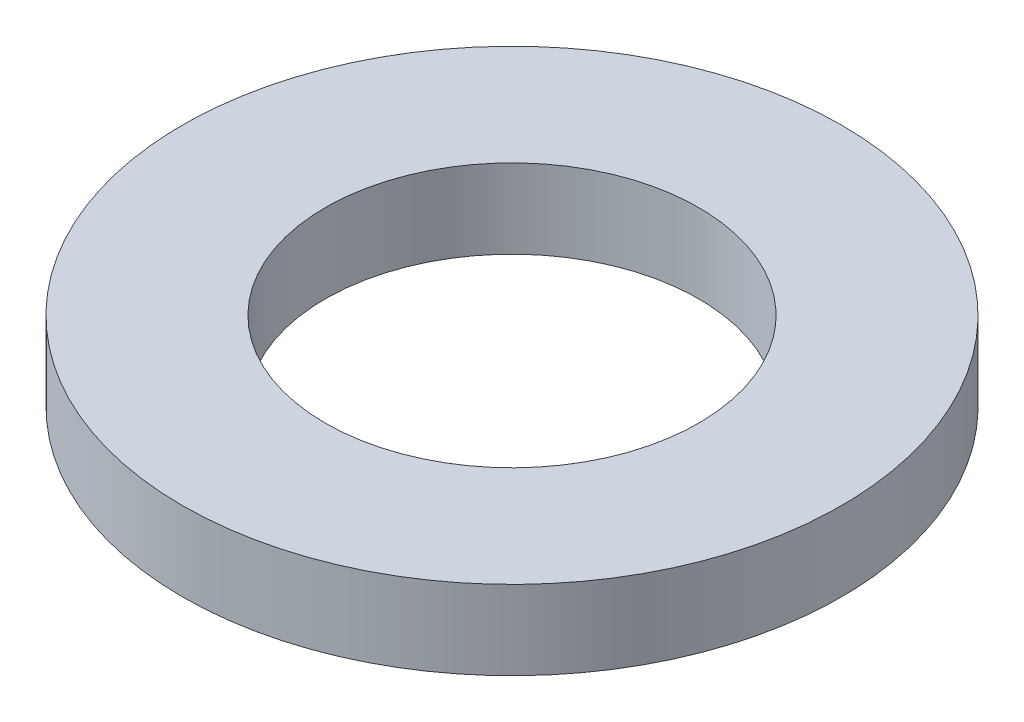
ISO-10303-21;
HEADER;
FILE_DESCRIPTION(('STEP AP214'),'2;1');
FILE_NAME('part.step','',(''),(''),'','','');
FILE_SCHEMA(('AUTOMOTIVE_DESIGN { 1 0 10303 214 1 1 1 1 }'));
ENDSEC;
DATA;
#1=APPLICATION_CONTEXT('core data for automotive mechanical design processes');
#2=APPLICATION_PROTOCOL_DEFINITION('international standard','automotive_design',2000,#1);
#3=PRODUCT_CONTEXT('',#1,'mechanical');
#4=PRODUCT('Part','Part','',(#3));
#5=PRODUCT_RELATED_PRODUCT_CATEGORY('part','',(#4));
#6=PRODUCT_DEFINITION_FORMATION('','',#4);
#7=PRODUCT_DEFINITION_CONTEXT('part definition',#1,'design');
#8=PRODUCT_DEFINITION('design','',#6,#7);
#9=PRODUCT_DEFINITION_SHAPE('','',#8);
#10=(LENGTH_UNIT() NAMED_UNIT(*) SI_UNIT(.MILLI.,.METRE.));
#11=(NAMED_UNIT(*) PLANE_ANGLE_UNIT() SI_UNIT($,.RADIAN.));
#12=(NAMED_UNIT(*) SI_UNIT($,.STERADIAN.) SOLID_ANGLE_UNIT());
#13=UNCERTAINTY_MEASURE_WITH_UNIT(LENGTH_MEASURE(1.E-05),#10,'distance_accuracy_value','');
#14=(GEOMETRIC_REPRESENTATION_CONTEXT(3) GLOBAL_UNCERTAINTY_ASSIGNED_CONTEXT((#13)) GLOBAL_UNIT_ASSIGNED_CONTEXT((#10,
#11,#12)) REPRESENTATION_CONTEXT('',''));
#15=CARTESIAN_POINT('',(0.,0.,0.));
#16=DIRECTION('',(0.,0.,1.));
#17=DIRECTION('',(1.,0.,0.));
#18=AXIS2_PLACEMENT_3D('',#15,#16,#17);
#19=CARTESIAN_POINT('',(0.,1.8,0.));
#20=DIRECTION('',(0.,1.,0.));
#21=DIRECTION('',(0.,0.,1.));
#22=AXIS2_PLACEMENT_3D('',#19,#20,#21);
#23=PLANE('',#22);
#24=CARTESIAN_POINT('',(0.,1.8,0.));
#25=DIRECTION('',(0.,1.,0.));
#26=DIRECTION('',(0.,0.,1.));
#27=AXIS2_PLACEMENT_3D('',#24,#25,#26);
#28=CIRCLE('',#27,7.5);
#29=CARTESIAN_POINT('',(0.,1.8,7.5));
#30=VERTEX_POINT('',#29);
#31=EDGE_CURVE('E10',#30,#30,#28,.T.);
#32=ORIENTED_EDGE('',*,*,#31,.T.);
#33=EDGE_LOOP('',(#32));
#34=FACE_BOUND('',#33,.T.);
#35=CARTESIAN_POINT('',(0.,1.8,0.));
#36=DIRECTION('',(0.,1.,0.));
#37=DIRECTION('',(0.,0.,1.));
#38=AXIS2_PLACEMENT_3D('',#35,#36,#37);
#39=CIRCLE('',#38,4.25);
#40=CARTESIAN_POINT('',(0.,1.8,4.25));
#41=VERTEX_POINT('',#40);
#42=EDGE_CURVE('E50',#41,#41,#39,.T.);
#43=ORIENTED_EDGE('',*,*,#42,.F.);
#44=EDGE_LOOP('',(#43));
#45=FACE_BOUND('',#44,.T.);
#46=ADVANCED_FACE('F39',(#34,#45),#23,.T.);
#47=CARTESIAN_POINT('',(0.,0.,0.));
#48=DIRECTION('',(0.,1.,0.));
#49=DIRECTION('',(0.,0.,1.));
#50=AXIS2_PLACEMENT_3D('',#47,#48,#49);
#51=PLANE('',#50);
#52=CARTESIAN_POINT('',(0.,0.,0.));
#53=DIRECTION('',(0.,1.,0.));
#54=DIRECTION('',(0.,0.,1.));
#55=AXIS2_PLACEMENT_3D('',#52,#53,#54);
#56=CIRCLE('',#55,7.5);
#57=CARTESIAN_POINT('',(0.,0.,7.5));
#58=VERTEX_POINT('',#57);
#59=EDGE_CURVE('E43',#58,#58,#56,.T.);
#60=ORIENTED_EDGE('',*,*,#59,.F.);
#61=EDGE_LOOP('',(#60));
#62=FACE_BOUND('',#61,.T.);
#63=CARTESIAN_POINT('',(0.,0.,0.));
#64=DIRECTION('',(0.,1.,0.));
#65=DIRECTION('',(0.,0.,1.));
#66=AXIS2_PLACEMENT_3D('',#63,#64,#65);
#67=CIRCLE('',#66,4.25);
#68=CARTESIAN_POINT('',(0.,0.,4.25));
#69=VERTEX_POINT('',#68);
#70=EDGE_CURVE('E52',#69,#69,#67,.T.);
#71=ORIENTED_EDGE('',*,*,#70,.T.);
#72=EDGE_LOOP('',(#71));
#73=FACE_BOUND('',#72,.T.);
#74=ADVANCED_FACE('F62',(#62,#73),#51,.F.);
#75=CARTESIAN_POINT('',(0.,1.8,0.));
#76=DIRECTION('',(0.,-1.,0.));
#77=DIRECTION('',(0.,0.,-1.));
#78=AXIS2_PLACEMENT_3D('',#75,#76,#77);
#79=CYLINDRICAL_SURFACE('',#78,7.5);
#80=ORIENTED_EDGE('',*,*,#31,.F.);
#81=EDGE_LOOP('',(#80));
#82=FACE_BOUND('',#81,.T.);
#83=ORIENTED_EDGE('',*,*,#59,.T.);
#84=EDGE_LOOP('',(#83));
#85=FACE_BOUND('',#84,.T.);
#86=ADVANCED_FACE('F41',(#82,#85),#79,.T.);
#87=CARTESIAN_POINT('',(0.,1.8,0.));
#88=DIRECTION('',(0.,-1.,0.));
#89=DIRECTION('',(0.,0.,-1.));
#90=AXIS2_PLACEMENT_3D('',#87,#88,#89);
#91=CYLINDRICAL_SURFACE('',#90,4.25);
#92=ORIENTED_EDGE('',*,*,#42,.T.);
#93=EDGE_LOOP('',(#92));
#94=FACE_BOUND('',#93,.T.);
#95=ORIENTED_EDGE('',*,*,#70,.F.);
#96=EDGE_LOOP('',(#95));
#97=FACE_BOUND('',#96,.T.);
#98=ADVANCED_FACE('F58',(#94,#97),#91,.F.);
#99=CLOSED_SHELL('',(#46,#74,#86,#98));
#100=MANIFOLD_SOLID_BREP('B2',#99);
#101=ADVANCED_BREP_SHAPE_REPRESENTATION('',(#18,#100),#14);
#102=SHAPE_DEFINITION_REPRESENTATION(#9,#101);
ENDSEC;
END-ISO-10303-21;
